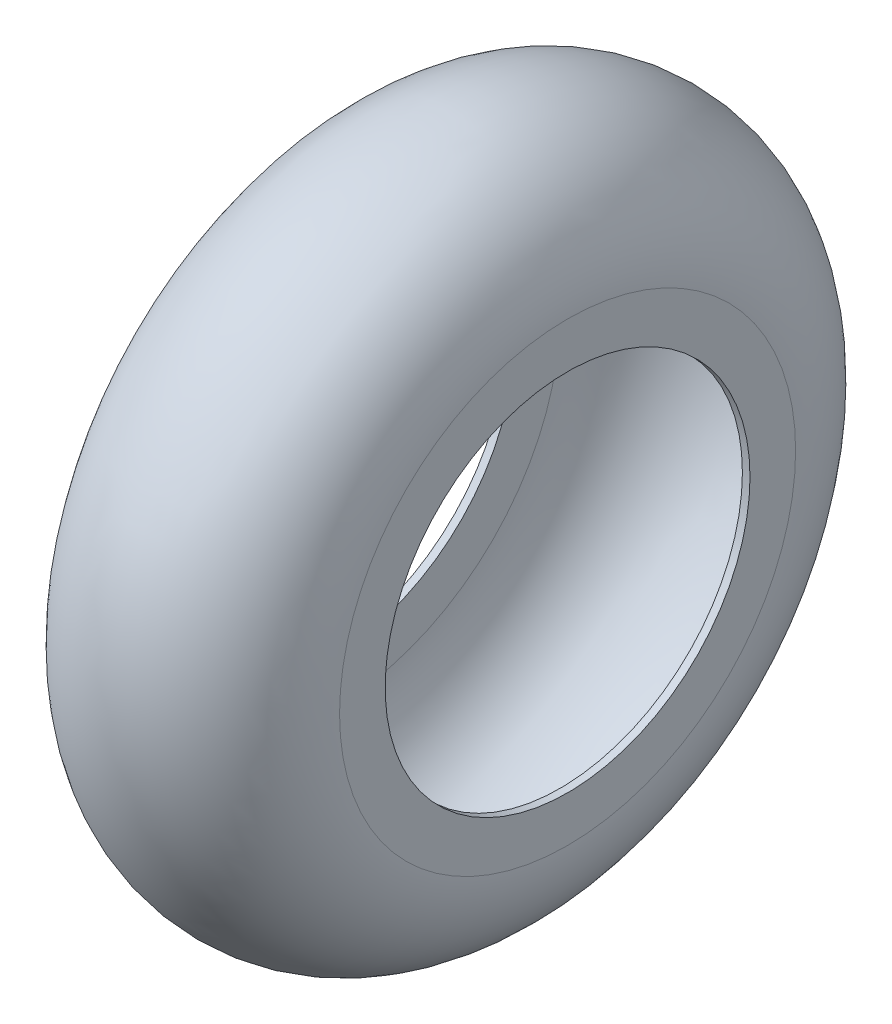
ISO-10303-21;
HEADER;
FILE_DESCRIPTION(('STEP AP214'),'2;1');
FILE_NAME('part.step','',(''),(''),'','','');
FILE_SCHEMA(('AUTOMOTIVE_DESIGN { 1 0 10303 214 1 1 1 1 }'));
ENDSEC;
DATA;
#1=APPLICATION_CONTEXT('core data for automotive mechanical design processes');
#2=APPLICATION_PROTOCOL_DEFINITION('international standard','automotive_design',2000,#1);
#3=PRODUCT_CONTEXT('',#1,'mechanical');
#4=PRODUCT('Part','Part','',(#3));
#5=PRODUCT_RELATED_PRODUCT_CATEGORY('part','',(#4));
#6=PRODUCT_DEFINITION_FORMATION('','',#4);
#7=PRODUCT_DEFINITION_CONTEXT('part definition',#1,'design');
#8=PRODUCT_DEFINITION('design','',#6,#7);
#9=PRODUCT_DEFINITION_SHAPE('','',#8);
#10=(LENGTH_UNIT() NAMED_UNIT(*) SI_UNIT(.MILLI.,.METRE.));
#11=(NAMED_UNIT(*) PLANE_ANGLE_UNIT() SI_UNIT($,.RADIAN.));
#12=(NAMED_UNIT(*) SI_UNIT($,.STERADIAN.) SOLID_ANGLE_UNIT());
#13=UNCERTAINTY_MEASURE_WITH_UNIT(LENGTH_MEASURE(1.E-05),#10,'distance_accuracy_value','');
#14=(GEOMETRIC_REPRESENTATION_CONTEXT(3) GLOBAL_UNCERTAINTY_ASSIGNED_CONTEXT((#13)) GLOBAL_UNIT_ASSIGNED_CONTEXT((#10,
#11,#12)) REPRESENTATION_CONTEXT('',''));
#15=CARTESIAN_POINT('',(0.,0.,0.));
#16=DIRECTION('',(0.,0.,1.));
#17=DIRECTION('',(1.,0.,0.));
#18=AXIS2_PLACEMENT_3D('',#15,#16,#17);
#19=CARTESIAN_POINT('',(-203.2,0.,0.));
#20=DIRECTION('',(1.,0.,0.));
#21=DIRECTION('',(0.,0.,-1.));
#22=AXIS2_PLACEMENT_3D('',#19,#20,#21);
#23=CYLINDRICAL_SURFACE('',#22,152.4);
#24=CARTESIAN_POINT('',(0.,0.,0.));
#25=DIRECTION('',(1.,0.,0.));
#26=DIRECTION('',(0.,0.,-1.));
#27=AXIS2_PLACEMENT_3D('',#24,#25,#26);
#28=CIRCLE('',#27,152.4);
#29=CARTESIAN_POINT('',(0.,0.,-152.4));
#30=VERTEX_POINT('',#29);
#31=EDGE_CURVE('E56',#30,#30,#28,.T.);
#32=ORIENTED_EDGE('',*,*,#31,.T.);
#33=EDGE_LOOP('',(#32));
#34=FACE_BOUND('',#33,.T.);
#35=CARTESIAN_POINT('',(-6.34999999999999,0.,0.));
#36=DIRECTION('',(1.,0.,0.));
#37=DIRECTION('',(0.,0.,-1.));
#38=AXIS2_PLACEMENT_3D('',#35,#36,#37);
#39=CIRCLE('',#38,152.4);
#40=CARTESIAN_POINT('',(-6.34999999999999,0.,-152.4));
#41=VERTEX_POINT('',#40);
#42=EDGE_CURVE('E62',#41,#41,#39,.T.);
#43=ORIENTED_EDGE('',*,*,#42,.F.);
#44=EDGE_LOOP('',(#43));
#45=FACE_BOUND('',#44,.T.);
#46=ADVANCED_FACE('F40',(#34,#45),#23,.F.);
#47=CARTESIAN_POINT('',(-101.6,0.,0.));
#48=DIRECTION('',(1.,0.,0.));
#49=DIRECTION('',(0.,0.,-1.));
#50=AXIS2_PLACEMENT_3D('',#47,#48,#49);
#51=TOROIDAL_SURFACE('',#50,190.5,101.6);
#52=CARTESIAN_POINT('',(-203.2,0.,0.));
#53=DIRECTION('',(1.,0.,0.));
#54=DIRECTION('',(0.,0.,-1.));
#55=AXIS2_PLACEMENT_3D('',#52,#53,#54);
#56=CIRCLE('',#55,190.5);
#57=CARTESIAN_POINT('',(-203.2,0.,-190.5));
#58=VERTEX_POINT('',#57);
#59=EDGE_CURVE('E48',#58,#58,#56,.F.);
#60=ORIENTED_EDGE('',*,*,#59,.F.);
#61=EDGE_LOOP('',(#60));
#62=FACE_BOUND('',#61,.T.);
#63=CARTESIAN_POINT('',(0.,0.,0.));
#64=DIRECTION('',(1.,0.,0.));
#65=DIRECTION('',(0.,0.,-1.));
#66=AXIS2_PLACEMENT_3D('',#63,#64,#65);
#67=CIRCLE('',#66,190.5);
#68=CARTESIAN_POINT('',(0.,0.,-190.5));
#69=VERTEX_POINT('',#68);
#70=EDGE_CURVE('E10',#69,#69,#67,.T.);
#71=ORIENTED_EDGE('',*,*,#70,.F.);
#72=EDGE_LOOP('',(#71));
#73=FACE_BOUND('',#72,.T.);
#74=ADVANCED_FACE('F43',(#62,#73),#51,.T.);
#75=CARTESIAN_POINT('',(-203.2,0.,0.));
#76=DIRECTION('',(1.,0.,0.));
#77=DIRECTION('',(0.,0.,-1.));
#78=AXIS2_PLACEMENT_3D('',#75,#76,#77);
#79=PLANE('',#78);
#80=ORIENTED_EDGE('',*,*,#59,.T.);
#81=EDGE_LOOP('',(#80));
#82=FACE_BOUND('',#81,.T.);
#83=CARTESIAN_POINT('',(-203.2,0.,0.));
#84=DIRECTION('',(1.,0.,0.));
#85=DIRECTION('',(0.,0.,-1.));
#86=AXIS2_PLACEMENT_3D('',#83,#84,#85);
#87=CIRCLE('',#86,152.4);
#88=CARTESIAN_POINT('',(-203.2,0.,-152.4));
#89=VERTEX_POINT('',#88);
#90=EDGE_CURVE('E52',#89,#89,#87,.T.);
#91=ORIENTED_EDGE('',*,*,#90,.T.);
#92=EDGE_LOOP('',(#91));
#93=FACE_BOUND('',#92,.T.);
#94=ADVANCED_FACE('F91',(#82,#93),#79,.F.);
#95=CARTESIAN_POINT('',(0.,0.,0.));
#96=DIRECTION('',(1.,0.,0.));
#97=DIRECTION('',(0.,0.,-1.));
#98=AXIS2_PLACEMENT_3D('',#95,#96,#97);
#99=PLANE('',#98);
#100=ORIENTED_EDGE('',*,*,#70,.T.);
#101=EDGE_LOOP('',(#100));
#102=FACE_BOUND('',#101,.T.);
#103=ORIENTED_EDGE('',*,*,#31,.F.);
#104=EDGE_LOOP('',(#103));
#105=FACE_BOUND('',#104,.T.);
#106=ADVANCED_FACE('F87',(#102,#105),#99,.T.);
#107=CARTESIAN_POINT('',(-196.85,0.,0.));
#108=DIRECTION('',(1.,0.,0.));
#109=DIRECTION('',(0.,0.,-1.));
#110=AXIS2_PLACEMENT_3D('',#107,#108,#109);
#111=CIRCLE('',#110,152.4);
#112=CARTESIAN_POINT('',(-196.85,0.,-152.4));
#113=VERTEX_POINT('',#112);
#114=EDGE_CURVE('E65',#113,#113,#111,.T.);
#115=ORIENTED_EDGE('',*,*,#114,.T.);
#116=EDGE_LOOP('',(#115));
#117=FACE_BOUND('',#116,.T.);
#118=ORIENTED_EDGE('',*,*,#90,.F.);
#119=EDGE_LOOP('',(#118));
#120=FACE_BOUND('',#119,.T.);
#121=ADVANCED_FACE('F84',(#117,#120),#23,.F.);
#122=CARTESIAN_POINT('',(-101.6,0.,0.));
#123=DIRECTION('',(1.,0.,0.));
#124=DIRECTION('',(0.,0.,-1.));
#125=AXIS2_PLACEMENT_3D('',#122,#123,#124);
#126=TOROIDAL_SURFACE('',#125,190.5,95.25);
#127=CARTESIAN_POINT('',(-196.85,0.,0.));
#128=DIRECTION('',(1.,0.,0.));
#129=DIRECTION('',(0.,0.,-1.));
#130=AXIS2_PLACEMENT_3D('',#127,#128,#129);
#131=CIRCLE('',#130,190.5);
#132=CARTESIAN_POINT('',(-196.85,0.,-190.5));
#133=VERTEX_POINT('',#132);
#134=EDGE_CURVE('E68',#133,#133,#131,.F.);
#135=ORIENTED_EDGE('',*,*,#134,.T.);
#136=EDGE_LOOP('',(#135));
#137=FACE_BOUND('',#136,.T.);
#138=CARTESIAN_POINT('',(-6.35000000000001,0.,0.));
#139=DIRECTION('',(1.,0.,0.));
#140=DIRECTION('',(0.,0.,-1.));
#141=AXIS2_PLACEMENT_3D('',#138,#139,#140);
#142=CIRCLE('',#141,190.5);
#143=CARTESIAN_POINT('',(-6.35000000000001,0.,-190.5));
#144=VERTEX_POINT('',#143);
#145=EDGE_CURVE('E60',#144,#144,#142,.T.);
#146=ORIENTED_EDGE('',*,*,#145,.T.);
#147=EDGE_LOOP('',(#146));
#148=FACE_BOUND('',#147,.T.);
#149=ADVANCED_FACE('F74',(#137,#148),#126,.F.);
#150=CARTESIAN_POINT('',(-196.85,0.,0.));
#151=DIRECTION('',(1.,0.,0.));
#152=DIRECTION('',(0.,0.,-1.));
#153=AXIS2_PLACEMENT_3D('',#150,#151,#152);
#154=PLANE('',#153);
#155=ORIENTED_EDGE('',*,*,#134,.F.);
#156=EDGE_LOOP('',(#155));
#157=FACE_BOUND('',#156,.T.);
#158=ORIENTED_EDGE('',*,*,#114,.F.);
#159=EDGE_LOOP('',(#158));
#160=FACE_BOUND('',#159,.T.);
#161=ADVANCED_FACE('F77',(#157,#160),#154,.T.);
#162=CARTESIAN_POINT('',(-6.35,0.,0.));
#163=DIRECTION('',(1.,0.,0.));
#164=DIRECTION('',(0.,0.,-1.));
#165=AXIS2_PLACEMENT_3D('',#162,#163,#164);
#166=PLANE('',#165);
#167=ORIENTED_EDGE('',*,*,#145,.F.);
#168=EDGE_LOOP('',(#167));
#169=FACE_BOUND('',#168,.T.);
#170=ORIENTED_EDGE('',*,*,#42,.T.);
#171=EDGE_LOOP('',(#170));
#172=FACE_BOUND('',#171,.T.);
#173=ADVANCED_FACE('F80',(#169,#172),#166,.F.);
#174=CLOSED_SHELL('',(#46,#74,#94,#106,#121,#149,#161,#173));
#175=MANIFOLD_SOLID_BREP('B2',#174);
#176=ADVANCED_BREP_SHAPE_REPRESENTATION('',(#18,#175),#14);
#177=SHAPE_DEFINITION_REPRESENTATION(#9,#176);
ENDSEC;
END-ISO-10303-21;
